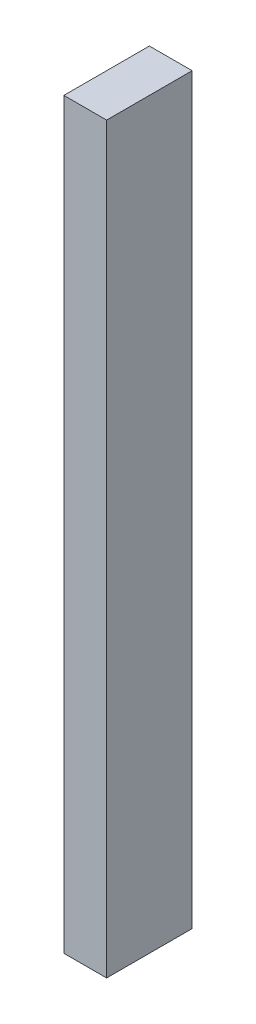
ISO-10303-21;
HEADER;
FILE_DESCRIPTION(('STEP AP214'),'2;1');
FILE_NAME('part.step','',(''),(''),'','','');
FILE_SCHEMA(('AUTOMOTIVE_DESIGN { 1 0 10303 214 1 1 1 1 }'));
ENDSEC;
DATA;
#1=APPLICATION_CONTEXT('core data for automotive mechanical design processes');
#2=APPLICATION_PROTOCOL_DEFINITION('international standard','automotive_design',2000,#1);
#3=PRODUCT_CONTEXT('',#1,'mechanical');
#4=PRODUCT('Part','Part','',(#3));
#5=PRODUCT_RELATED_PRODUCT_CATEGORY('part','',(#4));
#6=PRODUCT_DEFINITION_FORMATION('','',#4);
#7=PRODUCT_DEFINITION_CONTEXT('part definition',#1,'design');
#8=PRODUCT_DEFINITION('design','',#6,#7);
#9=PRODUCT_DEFINITION_SHAPE('','',#8);
#10=(LENGTH_UNIT() NAMED_UNIT(*) SI_UNIT(.MILLI.,.METRE.));
#11=(NAMED_UNIT(*) PLANE_ANGLE_UNIT() SI_UNIT($,.RADIAN.));
#12=(NAMED_UNIT(*) SI_UNIT($,.STERADIAN.) SOLID_ANGLE_UNIT());
#13=UNCERTAINTY_MEASURE_WITH_UNIT(LENGTH_MEASURE(1.E-05),#10,'distance_accuracy_value','');
#14=(GEOMETRIC_REPRESENTATION_CONTEXT(3) GLOBAL_UNCERTAINTY_ASSIGNED_CONTEXT((#13)) GLOBAL_UNIT_ASSIGNED_CONTEXT((#10,
#11,#12)) REPRESENTATION_CONTEXT('',''));
#15=CARTESIAN_POINT('',(0.,0.,0.));
#16=DIRECTION('',(0.,0.,1.));
#17=DIRECTION('',(1.,0.,0.));
#18=AXIS2_PLACEMENT_3D('',#15,#16,#17);
#19=CARTESIAN_POINT('',(-20.,695.,40.));
#20=DIRECTION('',(1.,0.,0.));
#21=DIRECTION('',(0.,0.,-1.));
#22=AXIS2_PLACEMENT_3D('',#19,#20,#21);
#23=PLANE('',#22);
#24=DIRECTION('',(0.,0.,1.));
#25=VECTOR('',#24,1.);
#26=CARTESIAN_POINT('',(-20.,0.,40.));
#27=LINE('',#26,#25);
#28=CARTESIAN_POINT('',(-20.,0.,-40.));
#29=VERTEX_POINT('',#28);
#30=CARTESIAN_POINT('',(-20.,0.,40.));
#31=VERTEX_POINT('',#30);
#32=EDGE_CURVE('E99',#29,#31,#27,.T.);
#33=ORIENTED_EDGE('',*,*,#32,.T.);
#34=DIRECTION('',(0.,-1.,0.));
#35=VECTOR('',#34,1.);
#36=CARTESIAN_POINT('',(-20.,695.,40.));
#37=LINE('',#36,#35);
#38=CARTESIAN_POINT('',(-20.,695.,40.));
#39=VERTEX_POINT('',#38);
#40=EDGE_CURVE('E11',#39,#31,#37,.T.);
#41=ORIENTED_EDGE('',*,*,#40,.F.);
#42=DIRECTION('',(0.,0.,1.));
#43=VECTOR('',#42,1.);
#44=CARTESIAN_POINT('',(-20.,695.,40.));
#45=LINE('',#44,#43);
#46=CARTESIAN_POINT('',(-20.,695.,-40.));
#47=VERTEX_POINT('',#46);
#48=EDGE_CURVE('E87',#47,#39,#45,.T.);
#49=ORIENTED_EDGE('',*,*,#48,.F.);
#50=DIRECTION('',(0.,-1.,0.));
#51=VECTOR('',#50,1.);
#52=CARTESIAN_POINT('',(-20.,695.,-40.));
#53=LINE('',#52,#51);
#54=EDGE_CURVE('E95',#47,#29,#53,.T.);
#55=ORIENTED_EDGE('',*,*,#54,.T.);
#56=EDGE_LOOP('',(#33,#41,#49,#55));
#57=FACE_BOUND('',#56,.T.);
#58=ADVANCED_FACE('F36',(#57),#23,.F.);
#59=CARTESIAN_POINT('',(20.,695.,40.));
#60=DIRECTION('',(0.,0.,-1.));
#61=DIRECTION('',(-1.,0.,0.));
#62=AXIS2_PLACEMENT_3D('',#59,#60,#61);
#63=PLANE('',#62);
#64=DIRECTION('',(1.,0.,0.));
#65=VECTOR('',#64,1.);
#66=CARTESIAN_POINT('',(20.,0.,40.));
#67=LINE('',#66,#65);
#68=CARTESIAN_POINT('',(20.,0.,40.));
#69=VERTEX_POINT('',#68);
#70=EDGE_CURVE('E91',#31,#69,#67,.T.);
#71=ORIENTED_EDGE('',*,*,#70,.T.);
#72=DIRECTION('',(0.,-1.,0.));
#73=VECTOR('',#72,1.);
#74=CARTESIAN_POINT('',(20.,695.,40.));
#75=LINE('',#74,#73);
#76=CARTESIAN_POINT('',(20.,695.,40.));
#77=VERTEX_POINT('',#76);
#78=EDGE_CURVE('E44',#77,#69,#75,.T.);
#79=ORIENTED_EDGE('',*,*,#78,.F.);
#80=DIRECTION('',(1.,0.,0.));
#81=VECTOR('',#80,1.);
#82=CARTESIAN_POINT('',(20.,695.,40.));
#83=LINE('',#82,#81);
#84=EDGE_CURVE('E82',#39,#77,#83,.T.);
#85=ORIENTED_EDGE('',*,*,#84,.F.);
#86=ORIENTED_EDGE('',*,*,#40,.T.);
#87=EDGE_LOOP('',(#71,#79,#85,#86));
#88=FACE_BOUND('',#87,.T.);
#89=ADVANCED_FACE('F90',(#88),#63,.F.);
#90=CARTESIAN_POINT('',(20.,695.,40.));
#91=DIRECTION('',(-1.,0.,0.));
#92=DIRECTION('',(0.,0.,1.));
#93=AXIS2_PLACEMENT_3D('',#90,#91,#92);
#94=PLANE('',#93);
#95=DIRECTION('',(0.,0.,-1.));
#96=VECTOR('',#95,1.);
#97=CARTESIAN_POINT('',(20.,0.,40.));
#98=LINE('',#97,#96);
#99=CARTESIAN_POINT('',(20.,0.,-40.));
#100=VERTEX_POINT('',#99);
#101=EDGE_CURVE('E69',#69,#100,#98,.T.);
#102=ORIENTED_EDGE('',*,*,#101,.T.);
#103=DIRECTION('',(0.,-1.,0.));
#104=VECTOR('',#103,1.);
#105=CARTESIAN_POINT('',(20.,695.,-40.));
#106=LINE('',#105,#104);
#107=CARTESIAN_POINT('',(20.,695.,-40.));
#108=VERTEX_POINT('',#107);
#109=EDGE_CURVE('E92',#108,#100,#106,.T.);
#110=ORIENTED_EDGE('',*,*,#109,.F.);
#111=DIRECTION('',(0.,0.,-1.));
#112=VECTOR('',#111,1.);
#113=CARTESIAN_POINT('',(20.,695.,40.));
#114=LINE('',#113,#112);
#115=EDGE_CURVE('E85',#77,#108,#114,.T.);
#116=ORIENTED_EDGE('',*,*,#115,.F.);
#117=ORIENTED_EDGE('',*,*,#78,.T.);
#118=EDGE_LOOP('',(#102,#110,#116,#117));
#119=FACE_BOUND('',#118,.T.);
#120=ADVANCED_FACE('F93',(#119),#94,.F.);
#121=CARTESIAN_POINT('',(20.,695.,-40.));
#122=DIRECTION('',(0.,0.,1.));
#123=DIRECTION('',(1.,0.,0.));
#124=AXIS2_PLACEMENT_3D('',#121,#122,#123);
#125=PLANE('',#124);
#126=DIRECTION('',(-1.,0.,0.));
#127=VECTOR('',#126,1.);
#128=CARTESIAN_POINT('',(20.,0.,-40.));
#129=LINE('',#128,#127);
#130=EDGE_CURVE('E75',#100,#29,#129,.T.);
#131=ORIENTED_EDGE('',*,*,#130,.T.);
#132=ORIENTED_EDGE('',*,*,#54,.F.);
#133=DIRECTION('',(-1.,0.,0.));
#134=VECTOR('',#133,1.);
#135=CARTESIAN_POINT('',(20.,695.,-40.));
#136=LINE('',#135,#134);
#137=EDGE_CURVE('E52',#108,#47,#136,.T.);
#138=ORIENTED_EDGE('',*,*,#137,.F.);
#139=ORIENTED_EDGE('',*,*,#109,.T.);
#140=EDGE_LOOP('',(#131,#132,#138,#139));
#141=FACE_BOUND('',#140,.T.);
#142=ADVANCED_FACE('F106',(#141),#125,.F.);
#143=CARTESIAN_POINT('',(0.,695.,0.));
#144=DIRECTION('',(0.,1.,0.));
#145=DIRECTION('',(0.,0.,1.));
#146=AXIS2_PLACEMENT_3D('',#143,#144,#145);
#147=PLANE('',#146);
#148=ORIENTED_EDGE('',*,*,#48,.T.);
#149=ORIENTED_EDGE('',*,*,#84,.T.);
#150=ORIENTED_EDGE('',*,*,#115,.T.);
#151=ORIENTED_EDGE('',*,*,#137,.T.);
#152=EDGE_LOOP('',(#148,#149,#150,#151));
#153=FACE_BOUND('',#152,.T.);
#154=ADVANCED_FACE('F83',(#153),#147,.T.);
#155=CARTESIAN_POINT('',(0.,0.,0.));
#156=DIRECTION('',(0.,1.,0.));
#157=DIRECTION('',(0.,0.,1.));
#158=AXIS2_PLACEMENT_3D('',#155,#156,#157);
#159=PLANE('',#158);
#160=ORIENTED_EDGE('',*,*,#32,.F.);
#161=ORIENTED_EDGE('',*,*,#130,.F.);
#162=ORIENTED_EDGE('',*,*,#101,.F.);
#163=ORIENTED_EDGE('',*,*,#70,.F.);
#164=EDGE_LOOP('',(#160,#161,#162,#163));
#165=FACE_BOUND('',#164,.T.);
#166=ADVANCED_FACE('F109',(#165),#159,.F.);
#167=CLOSED_SHELL('',(#58,#89,#120,#142,#154,#166));
#168=MANIFOLD_SOLID_BREP('B2',#167);
#169=ADVANCED_BREP_SHAPE_REPRESENTATION('',(#18,#168),#14);
#170=SHAPE_DEFINITION_REPRESENTATION(#9,#169);
ENDSEC;
END-ISO-10303-21;
